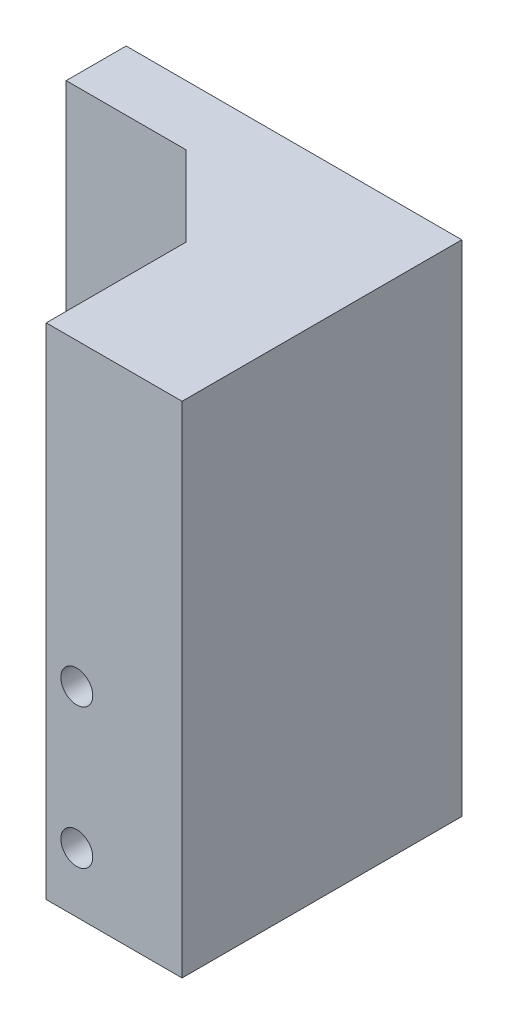
ISO-10303-21;
HEADER;
FILE_DESCRIPTION(('STEP AP214'),'2;1');
FILE_NAME('part.step','',(''),(''),'','','');
FILE_SCHEMA(('AUTOMOTIVE_DESIGN { 1 0 10303 214 1 1 1 1 }'));
ENDSEC;
DATA;
#1=APPLICATION_CONTEXT('core data for automotive mechanical design processes');
#2=APPLICATION_PROTOCOL_DEFINITION('international standard','automotive_design',2000,#1);
#3=PRODUCT_CONTEXT('',#1,'mechanical');
#4=PRODUCT('Part','Part','',(#3));
#5=PRODUCT_RELATED_PRODUCT_CATEGORY('part','',(#4));
#6=PRODUCT_DEFINITION_FORMATION('','',#4);
#7=PRODUCT_DEFINITION_CONTEXT('part definition',#1,'design');
#8=PRODUCT_DEFINITION('design','',#6,#7);
#9=PRODUCT_DEFINITION_SHAPE('','',#8);
#10=(LENGTH_UNIT() NAMED_UNIT(*) SI_UNIT(.MILLI.,.METRE.));
#11=(NAMED_UNIT(*) PLANE_ANGLE_UNIT() SI_UNIT($,.RADIAN.));
#12=(NAMED_UNIT(*) SI_UNIT($,.STERADIAN.) SOLID_ANGLE_UNIT());
#13=UNCERTAINTY_MEASURE_WITH_UNIT(LENGTH_MEASURE(1.E-05),#10,'distance_accuracy_value','');
#14=(GEOMETRIC_REPRESENTATION_CONTEXT(3) GLOBAL_UNCERTAINTY_ASSIGNED_CONTEXT((#13)) GLOBAL_UNIT_ASSIGNED_CONTEXT((#10,
#11,#12)) REPRESENTATION_CONTEXT('',''));
#15=CARTESIAN_POINT('',(0.,0.,0.));
#16=DIRECTION('',(0.,0.,1.));
#17=DIRECTION('',(1.,0.,0.));
#18=AXIS2_PLACEMENT_3D('',#15,#16,#17);
#19=CARTESIAN_POINT('',(0.,0.,3.));
#20=DIRECTION('',(0.,0.,1.));
#21=DIRECTION('',(1.,0.,0.));
#22=AXIS2_PLACEMENT_3D('',#19,#20,#21);
#23=PLANE('',#22);
#24=CARTESIAN_POINT('',(5.,-10.,3.));
#25=DIRECTION('',(0.,0.,1.));
#26=DIRECTION('',(1.,0.,0.));
#27=AXIS2_PLACEMENT_3D('',#24,#25,#26);
#28=CIRCLE('',#27,2.5);
#29=CARTESIAN_POINT('',(7.5,-10.,3.));
#30=VERTEX_POINT('',#29);
#31=EDGE_CURVE('E207',#30,#30,#28,.T.);
#32=ORIENTED_EDGE('',*,*,#31,.F.);
#33=EDGE_LOOP('',(#32));
#34=FACE_BOUND('',#33,.T.);
#35=DIRECTION('',(-1.,0.,0.));
#36=VECTOR('',#35,1.);
#37=CARTESIAN_POINT('',(0.,-20.,3.));
#38=LINE('',#37,#36);
#39=CARTESIAN_POINT('',(6.,-20.,3.));
#40=VERTEX_POINT('',#39);
#41=CARTESIAN_POINT('',(0.,-20.,3.));
#42=VERTEX_POINT('',#41);
#43=EDGE_CURVE('E142',#40,#42,#38,.T.);
#44=ORIENTED_EDGE('',*,*,#43,.F.);
#45=DIRECTION('',(0.,-1.,0.));
#46=VECTOR('',#45,1.);
#47=CARTESIAN_POINT('',(6.,-18.,3.));
#48=LINE('',#47,#46);
#49=CARTESIAN_POINT('',(6.,-18.,3.));
#50=VERTEX_POINT('',#49);
#51=EDGE_CURVE('E136',#50,#40,#48,.T.);
#52=ORIENTED_EDGE('',*,*,#51,.F.);
#53=DIRECTION('',(-1.,0.,0.));
#54=VECTOR('',#53,1.);
#55=CARTESIAN_POINT('',(6.,-18.,3.));
#56=LINE('',#55,#54);
#57=CARTESIAN_POINT('',(10.,-18.,3.));
#58=VERTEX_POINT('',#57);
#59=EDGE_CURVE('E122',#58,#50,#56,.T.);
#60=ORIENTED_EDGE('',*,*,#59,.F.);
#61=DIRECTION('',(0.,-1.,0.));
#62=VECTOR('',#61,1.);
#63=CARTESIAN_POINT('',(10.,0.,3.));
#64=LINE('',#63,#62);
#65=CARTESIAN_POINT('',(10.,-2.,3.));
#66=VERTEX_POINT('',#65);
#67=EDGE_CURVE('E195',#66,#58,#64,.T.);
#68=ORIENTED_EDGE('',*,*,#67,.F.);
#69=DIRECTION('',(-1.,0.,0.));
#70=VECTOR('',#69,1.);
#71=CARTESIAN_POINT('',(6.,-2.,3.));
#72=LINE('',#71,#70);
#73=CARTESIAN_POINT('',(6.,-2.,3.));
#74=VERTEX_POINT('',#73);
#75=EDGE_CURVE('E178',#66,#74,#72,.T.);
#76=ORIENTED_EDGE('',*,*,#75,.T.);
#77=DIRECTION('',(0.,1.,0.));
#78=VECTOR('',#77,1.);
#79=CARTESIAN_POINT('',(6.,-2.,3.));
#80=LINE('',#79,#78);
#81=CARTESIAN_POINT('',(6.,0.,3.));
#82=VERTEX_POINT('',#81);
#83=EDGE_CURVE('E183',#74,#82,#80,.T.);
#84=ORIENTED_EDGE('',*,*,#83,.T.);
#85=DIRECTION('',(-1.,0.,0.));
#86=VECTOR('',#85,1.);
#87=CARTESIAN_POINT('',(0.,0.,3.));
#88=LINE('',#87,#86);
#89=CARTESIAN_POINT('',(0.,0.,3.));
#90=VERTEX_POINT('',#89);
#91=EDGE_CURVE('E215',#82,#90,#88,.T.);
#92=ORIENTED_EDGE('',*,*,#91,.T.);
#93=DIRECTION('',(0.,-1.,0.));
#94=VECTOR('',#93,1.);
#95=CARTESIAN_POINT('',(0.,0.,3.));
#96=LINE('',#95,#94);
#97=EDGE_CURVE('E213',#90,#42,#96,.T.);
#98=ORIENTED_EDGE('',*,*,#97,.T.);
#99=EDGE_LOOP('',(#44,#52,#60,#68,#76,#84,#92,#98));
#100=FACE_BOUND('',#99,.T.);
#101=ADVANCED_FACE('F33',(#34,#100),#23,.T.);
#102=CARTESIAN_POINT('',(0.,0.,0.));
#103=DIRECTION('',(0.,0.,1.));
#104=DIRECTION('',(1.,0.,0.));
#105=AXIS2_PLACEMENT_3D('',#102,#103,#104);
#106=PLANE('',#105);
#107=DIRECTION('',(0.,1.,0.));
#108=VECTOR('',#107,1.);
#109=CARTESIAN_POINT('',(9.99999999999999,0.,0.));
#110=LINE('',#109,#108);
#111=CARTESIAN_POINT('',(10.,-25.,0.));
#112=VERTEX_POINT('',#111);
#113=CARTESIAN_POINT('',(10.,-20.,0.));
#114=VERTEX_POINT('',#113);
#115=EDGE_CURVE('E153',#112,#114,#110,.T.);
#116=ORIENTED_EDGE('',*,*,#115,.T.);
#117=DIRECTION('',(-1.,0.,0.));
#118=VECTOR('',#117,1.);
#119=CARTESIAN_POINT('',(0.,-20.,0.));
#120=LINE('',#119,#118);
#121=CARTESIAN_POINT('',(0.,-20.,0.));
#122=VERTEX_POINT('',#121);
#123=EDGE_CURVE('E157',#114,#122,#120,.T.);
#124=ORIENTED_EDGE('',*,*,#123,.T.);
#125=DIRECTION('',(0.,-1.,0.));
#126=VECTOR('',#125,1.);
#127=CARTESIAN_POINT('',(0.,0.,0.));
#128=LINE('',#127,#126);
#129=CARTESIAN_POINT('',(0.,0.,0.));
#130=VERTEX_POINT('',#129);
#131=EDGE_CURVE('E210',#130,#122,#128,.T.);
#132=ORIENTED_EDGE('',*,*,#131,.F.);
#133=DIRECTION('',(-1.,0.,0.));
#134=VECTOR('',#133,1.);
#135=CARTESIAN_POINT('',(0.,0.,0.));
#136=LINE('',#135,#134);
#137=CARTESIAN_POINT('',(16.8,0.,0.));
#138=VERTEX_POINT('',#137);
#139=EDGE_CURVE('E216',#138,#130,#136,.T.);
#140=ORIENTED_EDGE('',*,*,#139,.F.);
#141=DIRECTION('',(0.,1.,0.));
#142=VECTOR('',#141,1.);
#143=CARTESIAN_POINT('',(16.8,0.,0.));
#144=LINE('',#143,#142);
#145=CARTESIAN_POINT('',(16.8,-25.,0.));
#146=VERTEX_POINT('',#145);
#147=EDGE_CURVE('E220',#146,#138,#144,.T.);
#148=ORIENTED_EDGE('',*,*,#147,.F.);
#149=DIRECTION('',(1.,0.,0.));
#150=VECTOR('',#149,1.);
#151=CARTESIAN_POINT('',(0.,-25.,0.));
#152=LINE('',#151,#150);
#153=EDGE_CURVE('E185',#112,#146,#152,.T.);
#154=ORIENTED_EDGE('',*,*,#153,.F.);
#155=EDGE_LOOP('',(#116,#124,#132,#140,#148,#154));
#156=FACE_BOUND('',#155,.T.);
#157=CARTESIAN_POINT('',(5.,-10.,0.));
#158=DIRECTION('',(0.,0.,1.));
#159=DIRECTION('',(1.,0.,0.));
#160=AXIS2_PLACEMENT_3D('',#157,#158,#159);
#161=CIRCLE('',#160,2.5);
#162=CARTESIAN_POINT('',(7.5,-10.,0.));
#163=VERTEX_POINT('',#162);
#164=EDGE_CURVE('E206',#163,#163,#161,.T.);
#165=ORIENTED_EDGE('',*,*,#164,.T.);
#166=EDGE_LOOP('',(#165));
#167=FACE_BOUND('',#166,.T.);
#168=ADVANCED_FACE('F231',(#156,#167),#106,.F.);
#169=CARTESIAN_POINT('',(0.,0.,3.));
#170=DIRECTION('',(1.,0.,0.));
#171=DIRECTION('',(0.,1.,0.));
#172=AXIS2_PLACEMENT_3D('',#169,#170,#171);
#173=PLANE('',#172);
#174=ORIENTED_EDGE('',*,*,#131,.T.);
#175=DIRECTION('',(0.,0.,1.));
#176=VECTOR('',#175,1.);
#177=CARTESIAN_POINT('',(0.,-20.,-7.));
#178=LINE('',#177,#176);
#179=EDGE_CURVE('E150',#122,#42,#178,.T.);
#180=ORIENTED_EDGE('',*,*,#179,.T.);
#181=ORIENTED_EDGE('',*,*,#97,.F.);
#182=DIRECTION('',(0.,0.,-1.));
#183=VECTOR('',#182,1.);
#184=CARTESIAN_POINT('',(0.,0.,3.));
#185=LINE('',#184,#183);
#186=EDGE_CURVE('E41',#90,#130,#185,.T.);
#187=ORIENTED_EDGE('',*,*,#186,.T.);
#188=EDGE_LOOP('',(#174,#180,#181,#187));
#189=FACE_BOUND('',#188,.T.);
#190=ADVANCED_FACE('F35',(#189),#173,.F.);
#191=CARTESIAN_POINT('',(16.8,0.,3.));
#192=DIRECTION('',(-1.,0.,0.));
#193=DIRECTION('',(0.,-1.,0.));
#194=AXIS2_PLACEMENT_3D('',#191,#192,#193);
#195=PLANE('',#194);
#196=ORIENTED_EDGE('',*,*,#147,.T.);
#197=DIRECTION('',(0.,0.,-1.));
#198=VECTOR('',#197,1.);
#199=CARTESIAN_POINT('',(16.8,0.,3.));
#200=LINE('',#199,#198);
#201=CARTESIAN_POINT('',(16.8,0.,14.));
#202=VERTEX_POINT('',#201);
#203=EDGE_CURVE('E11',#202,#138,#200,.T.);
#204=ORIENTED_EDGE('',*,*,#203,.F.);
#205=DIRECTION('',(0.,1.,0.));
#206=VECTOR('',#205,1.);
#207=CARTESIAN_POINT('',(16.8,0.,14.));
#208=LINE('',#207,#206);
#209=CARTESIAN_POINT('',(16.8,-25.,14.));
#210=VERTEX_POINT('',#209);
#211=EDGE_CURVE('E198',#210,#202,#208,.T.);
#212=ORIENTED_EDGE('',*,*,#211,.F.);
#213=DIRECTION('',(0.,0.,1.));
#214=VECTOR('',#213,1.);
#215=CARTESIAN_POINT('',(16.8,-25.,0.));
#216=LINE('',#215,#214);
#217=EDGE_CURVE('E189',#146,#210,#216,.T.);
#218=ORIENTED_EDGE('',*,*,#217,.F.);
#219=EDGE_LOOP('',(#196,#204,#212,#218));
#220=FACE_BOUND('',#219,.T.);
#221=ADVANCED_FACE('F258',(#220),#195,.F.);
#222=CARTESIAN_POINT('',(0.,0.,3.));
#223=DIRECTION('',(0.,-1.,0.));
#224=DIRECTION('',(0.,0.,-1.));
#225=AXIS2_PLACEMENT_3D('',#222,#223,#224);
#226=PLANE('',#225);
#227=ORIENTED_EDGE('',*,*,#91,.F.);
#228=DIRECTION('',(0.707106781186548,0.,0.707106781186548));
#229=VECTOR('',#228,1.);
#230=CARTESIAN_POINT('',(10.,0.,7.));
#231=LINE('',#230,#229);
#232=CARTESIAN_POINT('',(10.,0.,7.));
#233=VERTEX_POINT('',#232);
#234=EDGE_CURVE('E172',#82,#233,#231,.T.);
#235=ORIENTED_EDGE('',*,*,#234,.T.);
#236=DIRECTION('',(0.,0.,-1.));
#237=VECTOR('',#236,1.);
#238=CARTESIAN_POINT('',(10.,0.,14.));
#239=LINE('',#238,#237);
#240=CARTESIAN_POINT('',(10.,0.,14.));
#241=VERTEX_POINT('',#240);
#242=EDGE_CURVE('E203',#241,#233,#239,.T.);
#243=ORIENTED_EDGE('',*,*,#242,.F.);
#244=DIRECTION('',(-1.,0.,0.));
#245=VECTOR('',#244,1.);
#246=CARTESIAN_POINT('',(10.,0.,14.));
#247=LINE('',#246,#245);
#248=EDGE_CURVE('E201',#202,#241,#247,.T.);
#249=ORIENTED_EDGE('',*,*,#248,.F.);
#250=ORIENTED_EDGE('',*,*,#203,.T.);
#251=ORIENTED_EDGE('',*,*,#139,.T.);
#252=ORIENTED_EDGE('',*,*,#186,.F.);
#253=EDGE_LOOP('',(#227,#235,#243,#249,#250,#251,#252));
#254=FACE_BOUND('',#253,.T.);
#255=ADVANCED_FACE('F248',(#254),#226,.F.);
#256=CARTESIAN_POINT('',(5.,-10.,3.));
#257=DIRECTION('',(0.,0.,-1.));
#258=DIRECTION('',(-1.,0.,0.));
#259=AXIS2_PLACEMENT_3D('',#256,#257,#258);
#260=CYLINDRICAL_SURFACE('',#259,2.5);
#261=ORIENTED_EDGE('',*,*,#31,.T.);
#262=EDGE_LOOP('',(#261));
#263=FACE_BOUND('',#262,.T.);
#264=ORIENTED_EDGE('',*,*,#164,.F.);
#265=EDGE_LOOP('',(#264));
#266=FACE_BOUND('',#265,.T.);
#267=ADVANCED_FACE('F264',(#263,#266),#260,.F.);
#268=CARTESIAN_POINT('',(10.,0.,14.));
#269=DIRECTION('',(1.,0.,0.));
#270=DIRECTION('',(0.,1.,0.));
#271=AXIS2_PLACEMENT_3D('',#268,#269,#270);
#272=PLANE('',#271);
#273=ORIENTED_EDGE('',*,*,#67,.T.);
#274=DIRECTION('',(0.,0.,-1.));
#275=VECTOR('',#274,1.);
#276=CARTESIAN_POINT('',(10.,-18.,3.));
#277=LINE('',#276,#275);
#278=CARTESIAN_POINT('',(10.,-18.,7.));
#279=VERTEX_POINT('',#278);
#280=EDGE_CURVE('E128',#279,#58,#277,.T.);
#281=ORIENTED_EDGE('',*,*,#280,.F.);
#282=DIRECTION('',(0.,-1.,0.));
#283=VECTOR('',#282,1.);
#284=CARTESIAN_POINT('',(10.,-18.,7.));
#285=LINE('',#284,#283);
#286=CARTESIAN_POINT('',(10.,-20.,7.));
#287=VERTEX_POINT('',#286);
#288=EDGE_CURVE('E139',#279,#287,#285,.T.);
#289=ORIENTED_EDGE('',*,*,#288,.T.);
#290=DIRECTION('',(0.,0.,1.));
#291=VECTOR('',#290,1.);
#292=CARTESIAN_POINT('',(10.,-20.,-7.));
#293=LINE('',#292,#291);
#294=EDGE_CURVE('E149',#114,#287,#293,.T.);
#295=ORIENTED_EDGE('',*,*,#294,.F.);
#296=ORIENTED_EDGE('',*,*,#115,.F.);
#297=DIRECTION('',(0.,0.,-1.));
#298=VECTOR('',#297,1.);
#299=CARTESIAN_POINT('',(10.,-25.,14.));
#300=LINE('',#299,#298);
#301=CARTESIAN_POINT('',(10.,-25.,14.));
#302=VERTEX_POINT('',#301);
#303=EDGE_CURVE('E56',#302,#112,#300,.T.);
#304=ORIENTED_EDGE('',*,*,#303,.F.);
#305=DIRECTION('',(0.,-1.,0.));
#306=VECTOR('',#305,1.);
#307=CARTESIAN_POINT('',(10.,0.,14.));
#308=LINE('',#307,#306);
#309=EDGE_CURVE('E196',#241,#302,#308,.T.);
#310=ORIENTED_EDGE('',*,*,#309,.F.);
#311=ORIENTED_EDGE('',*,*,#242,.T.);
#312=DIRECTION('',(0.,1.,0.));
#313=VECTOR('',#312,1.);
#314=CARTESIAN_POINT('',(10.,-2.,7.));
#315=LINE('',#314,#313);
#316=CARTESIAN_POINT('',(10.,-2.,7.));
#317=VERTEX_POINT('',#316);
#318=EDGE_CURVE('E180',#317,#233,#315,.T.);
#319=ORIENTED_EDGE('',*,*,#318,.F.);
#320=DIRECTION('',(0.,0.,-1.));
#321=VECTOR('',#320,1.);
#322=CARTESIAN_POINT('',(10.,-2.,3.));
#323=LINE('',#322,#321);
#324=EDGE_CURVE('E176',#317,#66,#323,.T.);
#325=ORIENTED_EDGE('',*,*,#324,.T.);
#326=EDGE_LOOP('',(#273,#281,#289,#295,#296,#304,#310,#311,#319,#325));
#327=FACE_BOUND('',#326,.T.);
#328=ADVANCED_FACE('F238',(#327),#272,.F.);
#329=CARTESIAN_POINT('',(0.,0.,14.));
#330=DIRECTION('',(0.,0.,1.));
#331=DIRECTION('',(1.,0.,0.));
#332=AXIS2_PLACEMENT_3D('',#329,#330,#331);
#333=PLANE('',#332);
#334=CARTESIAN_POINT('',(11.5297958971133,-15.,14.));
#335=DIRECTION('',(0.,0.,1.));
#336=DIRECTION('',(1.,0.,0.));
#337=AXIS2_PLACEMENT_3D('',#334,#335,#336);
#338=CIRCLE('',#337,0.799999999999999);
#339=CARTESIAN_POINT('',(12.3297958971133,-15.,14.));
#340=VERTEX_POINT('',#339);
#341=EDGE_CURVE('E160',#340,#340,#338,.T.);
#342=ORIENTED_EDGE('',*,*,#341,.F.);
#343=EDGE_LOOP('',(#342));
#344=FACE_BOUND('',#343,.T.);
#345=CARTESIAN_POINT('',(11.5297958971133,-22.,14.));
#346=DIRECTION('',(0.,0.,1.));
#347=DIRECTION('',(1.,0.,0.));
#348=AXIS2_PLACEMENT_3D('',#345,#346,#347);
#349=CIRCLE('',#348,0.799999999999999);
#350=CARTESIAN_POINT('',(12.3297958971133,-22.,14.));
#351=VERTEX_POINT('',#350);
#352=EDGE_CURVE('E166',#351,#351,#349,.T.);
#353=ORIENTED_EDGE('',*,*,#352,.F.);
#354=EDGE_LOOP('',(#353));
#355=FACE_BOUND('',#354,.T.);
#356=ORIENTED_EDGE('',*,*,#309,.T.);
#357=DIRECTION('',(-1.,0.,0.));
#358=VECTOR('',#357,1.);
#359=CARTESIAN_POINT('',(16.8,-25.,14.));
#360=LINE('',#359,#358);
#361=EDGE_CURVE('E192',#210,#302,#360,.T.);
#362=ORIENTED_EDGE('',*,*,#361,.F.);
#363=ORIENTED_EDGE('',*,*,#211,.T.);
#364=ORIENTED_EDGE('',*,*,#248,.T.);
#365=EDGE_LOOP('',(#356,#362,#363,#364));
#366=FACE_BOUND('',#365,.T.);
#367=ADVANCED_FACE('F254',(#344,#355,#366),#333,.T.);
#368=CARTESIAN_POINT('',(0.,-25.,0.));
#369=DIRECTION('',(0.,-1.,0.));
#370=DIRECTION('',(0.,0.,-1.));
#371=AXIS2_PLACEMENT_3D('',#368,#369,#370);
#372=PLANE('',#371);
#373=ORIENTED_EDGE('',*,*,#303,.T.);
#374=ORIENTED_EDGE('',*,*,#153,.T.);
#375=ORIENTED_EDGE('',*,*,#217,.T.);
#376=ORIENTED_EDGE('',*,*,#361,.T.);
#377=EDGE_LOOP('',(#373,#374,#375,#376));
#378=FACE_BOUND('',#377,.T.);
#379=ADVANCED_FACE('F255',(#378),#372,.T.);
#380=CARTESIAN_POINT('',(10.,-2.,7.));
#381=DIRECTION('',(-0.707106781186547,0.,0.707106781186547));
#382=DIRECTION('',(0.707106781186548,0.,0.707106781186548));
#383=AXIS2_PLACEMENT_3D('',#380,#381,#382);
#384=PLANE('',#383);
#385=ORIENTED_EDGE('',*,*,#234,.F.);
#386=ORIENTED_EDGE('',*,*,#83,.F.);
#387=DIRECTION('',(0.707106781186548,0.,0.707106781186548));
#388=VECTOR('',#387,1.);
#389=CARTESIAN_POINT('',(10.,-2.,7.));
#390=LINE('',#389,#388);
#391=EDGE_CURVE('E173',#74,#317,#390,.T.);
#392=ORIENTED_EDGE('',*,*,#391,.T.);
#393=ORIENTED_EDGE('',*,*,#318,.T.);
#394=EDGE_LOOP('',(#385,#386,#392,#393));
#395=FACE_BOUND('',#394,.T.);
#396=ADVANCED_FACE('F247',(#395),#384,.T.);
#397=CARTESIAN_POINT('',(0.,-2.,0.));
#398=DIRECTION('',(0.,-1.,0.));
#399=DIRECTION('',(0.,0.,-1.));
#400=AXIS2_PLACEMENT_3D('',#397,#398,#399);
#401=PLANE('',#400);
#402=ORIENTED_EDGE('',*,*,#391,.F.);
#403=ORIENTED_EDGE('',*,*,#75,.F.);
#404=ORIENTED_EDGE('',*,*,#324,.F.);
#405=EDGE_LOOP('',(#402,#403,#404));
#406=FACE_BOUND('',#405,.T.);
#407=ADVANCED_FACE('F244',(#406),#401,.T.);
#408=CARTESIAN_POINT('',(11.5297958971133,-22.,4.));
#409=DIRECTION('',(0.,0.,1.));
#410=DIRECTION('',(1.,0.,0.));
#411=AXIS2_PLACEMENT_3D('',#408,#409,#410);
#412=CONICAL_SURFACE('',#411,0.799999999999997,1.02974425867665);
#413=CARTESIAN_POINT('',(11.5297958971133,-22.,3.51931150477795));
#414=VERTEX_POINT('',#413);
#415=VERTEX_LOOP('',#414);
#416=FACE_BOUND('',#415,.T.);
#417=CARTESIAN_POINT('',(11.5297958971133,-22.,4.));
#418=DIRECTION('',(0.,0.,1.));
#419=DIRECTION('',(1.,0.,0.));
#420=AXIS2_PLACEMENT_3D('',#417,#418,#419);
#421=CIRCLE('',#420,0.799999999999997);
#422=CARTESIAN_POINT('',(12.3297958971133,-22.,4.));
#423=VERTEX_POINT('',#422);
#424=EDGE_CURVE('E169',#423,#423,#421,.T.);
#425=ORIENTED_EDGE('',*,*,#424,.T.);
#426=EDGE_LOOP('',(#425));
#427=FACE_BOUND('',#426,.T.);
#428=ADVANCED_FACE('F289',(#416,#427),#412,.F.);
#429=CARTESIAN_POINT('',(11.5297958971133,-22.,14.));
#430=DIRECTION('',(0.,0.,1.));
#431=DIRECTION('',(1.,0.,0.));
#432=AXIS2_PLACEMENT_3D('',#429,#430,#431);
#433=CYLINDRICAL_SURFACE('',#432,0.799999999999998);
#434=ORIENTED_EDGE('',*,*,#424,.F.);
#435=EDGE_LOOP('',(#434));
#436=FACE_BOUND('',#435,.T.);
#437=ORIENTED_EDGE('',*,*,#352,.T.);
#438=EDGE_LOOP('',(#437));
#439=FACE_BOUND('',#438,.T.);
#440=ADVANCED_FACE('F292',(#436,#439),#433,.F.);
#441=CARTESIAN_POINT('',(11.5297958971133,-15.,4.));
#442=DIRECTION('',(0.,0.,1.));
#443=DIRECTION('',(1.,0.,0.));
#444=AXIS2_PLACEMENT_3D('',#441,#442,#443);
#445=CONICAL_SURFACE('',#444,0.799999999999997,1.02974425867665);
#446=CARTESIAN_POINT('',(11.5297958971133,-15.,3.51931150477795));
#447=VERTEX_POINT('',#446);
#448=VERTEX_LOOP('',#447);
#449=FACE_BOUND('',#448,.T.);
#450=CARTESIAN_POINT('',(11.5297958971133,-15.,4.));
#451=DIRECTION('',(0.,0.,1.));
#452=DIRECTION('',(1.,0.,0.));
#453=AXIS2_PLACEMENT_3D('',#450,#451,#452);
#454=CIRCLE('',#453,0.799999999999997);
#455=CARTESIAN_POINT('',(12.3297958971133,-15.,4.));
#456=VERTEX_POINT('',#455);
#457=EDGE_CURVE('E163',#456,#456,#454,.T.);
#458=ORIENTED_EDGE('',*,*,#457,.T.);
#459=EDGE_LOOP('',(#458));
#460=FACE_BOUND('',#459,.T.);
#461=ADVANCED_FACE('F296',(#449,#460),#445,.F.);
#462=CARTESIAN_POINT('',(11.5297958971133,-15.,14.));
#463=DIRECTION('',(0.,0.,1.));
#464=DIRECTION('',(1.,0.,0.));
#465=AXIS2_PLACEMENT_3D('',#462,#463,#464);
#466=CYLINDRICAL_SURFACE('',#465,0.799999999999998);
#467=ORIENTED_EDGE('',*,*,#457,.F.);
#468=EDGE_LOOP('',(#467));
#469=FACE_BOUND('',#468,.T.);
#470=ORIENTED_EDGE('',*,*,#341,.T.);
#471=EDGE_LOOP('',(#470));
#472=FACE_BOUND('',#471,.T.);
#473=ADVANCED_FACE('F300',(#469,#472),#466,.F.);
#474=CARTESIAN_POINT('',(0.,-20.,-7.));
#475=DIRECTION('',(0.,1.,0.));
#476=DIRECTION('',(-1.,0.,0.));
#477=AXIS2_PLACEMENT_3D('',#474,#475,#476);
#478=PLANE('',#477);
#479=ORIENTED_EDGE('',*,*,#294,.T.);
#480=DIRECTION('',(0.707106781186548,0.,0.707106781186548));
#481=VECTOR('',#480,1.);
#482=CARTESIAN_POINT('',(10.,-20.,7.));
#483=LINE('',#482,#481);
#484=EDGE_CURVE('E48',#40,#287,#483,.T.);
#485=ORIENTED_EDGE('',*,*,#484,.F.);
#486=ORIENTED_EDGE('',*,*,#43,.T.);
#487=ORIENTED_EDGE('',*,*,#179,.F.);
#488=ORIENTED_EDGE('',*,*,#123,.F.);
#489=EDGE_LOOP('',(#479,#485,#486,#487,#488));
#490=FACE_BOUND('',#489,.T.);
#491=ADVANCED_FACE('F236',(#490),#478,.F.);
#492=CARTESIAN_POINT('',(10.,-18.,7.));
#493=DIRECTION('',(0.707106781186547,0.,-0.707106781186547));
#494=DIRECTION('',(-0.707106781186548,0.,-0.707106781186548));
#495=AXIS2_PLACEMENT_3D('',#492,#493,#494);
#496=PLANE('',#495);
#497=ORIENTED_EDGE('',*,*,#484,.T.);
#498=ORIENTED_EDGE('',*,*,#288,.F.);
#499=DIRECTION('',(0.707106781186548,0.,0.707106781186548));
#500=VECTOR('',#499,1.);
#501=CARTESIAN_POINT('',(10.,-18.,7.));
#502=LINE('',#501,#500);
#503=EDGE_CURVE('E125',#50,#279,#502,.T.);
#504=ORIENTED_EDGE('',*,*,#503,.F.);
#505=ORIENTED_EDGE('',*,*,#51,.T.);
#506=EDGE_LOOP('',(#497,#498,#504,#505));
#507=FACE_BOUND('',#506,.T.);
#508=ADVANCED_FACE('F135',(#507),#496,.F.);
#509=CARTESIAN_POINT('',(0.,-18.,0.));
#510=DIRECTION('',(0.,1.,0.));
#511=DIRECTION('',(0.,0.,-1.));
#512=AXIS2_PLACEMENT_3D('',#509,#510,#511);
#513=PLANE('',#512);
#514=ORIENTED_EDGE('',*,*,#503,.T.);
#515=ORIENTED_EDGE('',*,*,#280,.T.);
#516=ORIENTED_EDGE('',*,*,#59,.T.);
#517=EDGE_LOOP('',(#514,#515,#516));
#518=FACE_BOUND('',#517,.T.);
#519=ADVANCED_FACE('F124',(#518),#513,.T.);
#520=CLOSED_SHELL('',(#101,#168,#190,#221,#255,#267,#328,#367,#379,#396,#407,#428,#440,#461,
#473,#491,#508,#519));
#521=MANIFOLD_SOLID_BREP('B2',#520);
#522=ADVANCED_BREP_SHAPE_REPRESENTATION('',(#18,#521),#14);
#523=SHAPE_DEFINITION_REPRESENTATION(#9,#522);
ENDSEC;
END-ISO-10303-21;
